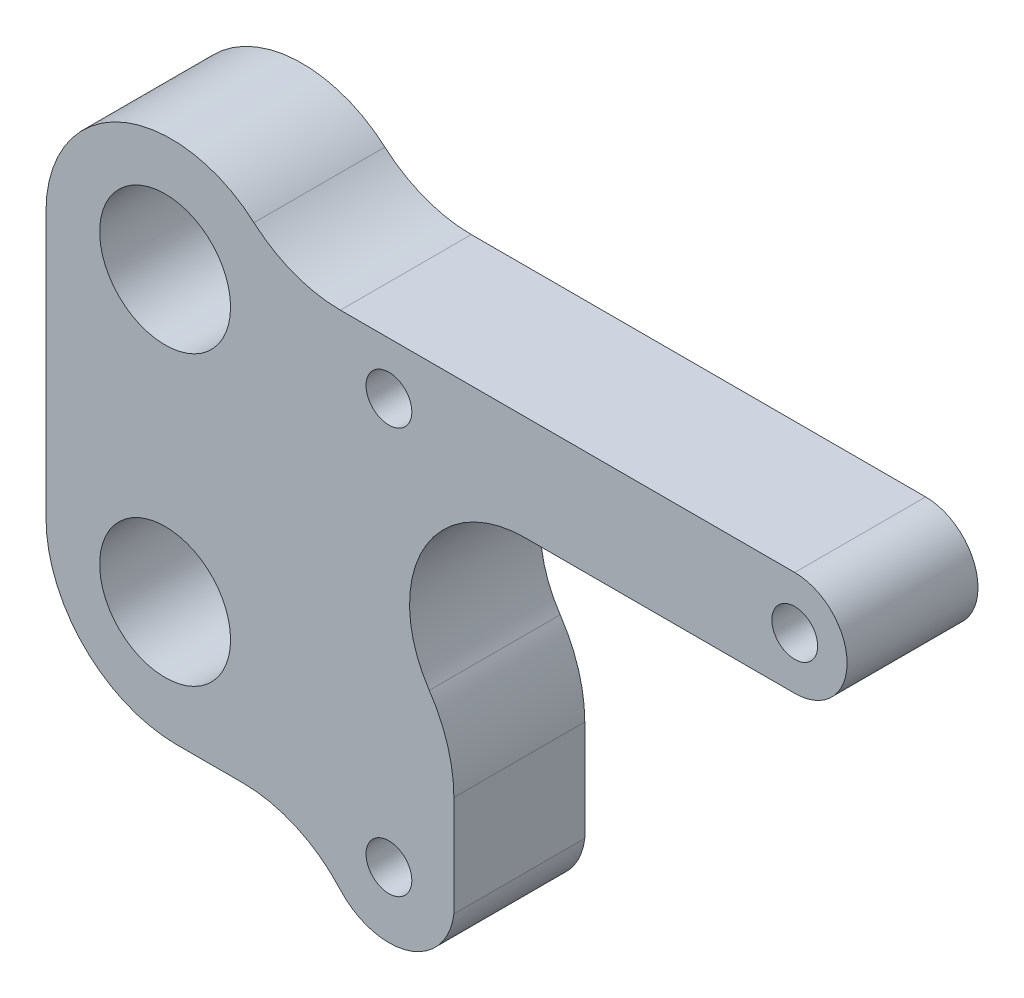
ISO-10303-21;
HEADER;
FILE_DESCRIPTION(('STEP AP214'),'2;1');
FILE_NAME('part.step','',(''),(''),'','','');
FILE_SCHEMA(('AUTOMOTIVE_DESIGN { 1 0 10303 214 1 1 1 1 }'));
ENDSEC;
DATA;
#1=APPLICATION_CONTEXT('core data for automotive mechanical design processes');
#2=APPLICATION_PROTOCOL_DEFINITION('international standard','automotive_design',2000,#1);
#3=PRODUCT_CONTEXT('',#1,'mechanical');
#4=PRODUCT('Part','Part','',(#3));
#5=PRODUCT_RELATED_PRODUCT_CATEGORY('part','',(#4));
#6=PRODUCT_DEFINITION_FORMATION('','',#4);
#7=PRODUCT_DEFINITION_CONTEXT('part definition',#1,'design');
#8=PRODUCT_DEFINITION('design','',#6,#7);
#9=PRODUCT_DEFINITION_SHAPE('','',#8);
#10=(LENGTH_UNIT() NAMED_UNIT(*) SI_UNIT(.MILLI.,.METRE.));
#11=(NAMED_UNIT(*) PLANE_ANGLE_UNIT() SI_UNIT($,.RADIAN.));
#12=(NAMED_UNIT(*) SI_UNIT($,.STERADIAN.) SOLID_ANGLE_UNIT());
#13=UNCERTAINTY_MEASURE_WITH_UNIT(LENGTH_MEASURE(1.E-05),#10,'distance_accuracy_value','');
#14=(GEOMETRIC_REPRESENTATION_CONTEXT(3) GLOBAL_UNCERTAINTY_ASSIGNED_CONTEXT((#13)) GLOBAL_UNIT_ASSIGNED_CONTEXT((#10,
#11,#12)) REPRESENTATION_CONTEXT('',''));
#15=CARTESIAN_POINT('',(0.,0.,0.));
#16=DIRECTION('',(0.,0.,1.));
#17=DIRECTION('',(1.,0.,0.));
#18=AXIS2_PLACEMENT_3D('',#15,#16,#17);
#19=CARTESIAN_POINT('',(46.6269499129951,18.5512629681283,-10.));
#20=DIRECTION('',(0.,0.,1.));
#21=DIRECTION('',(1.,0.,0.));
#22=AXIS2_PLACEMENT_3D('',#19,#20,#21);
#23=CYLINDRICAL_SURFACE('',#22,10.);
#24=CARTESIAN_POINT('',(46.6269499129951,18.5512629681283,0.));
#25=DIRECTION('',(0.,0.,1.));
#26=DIRECTION('',(-1.,0.,0.));
#27=AXIS2_PLACEMENT_3D('',#24,#25,#26);
#28=CIRCLE('',#27,10.);
#29=CARTESIAN_POINT('',(36.6269499129951,18.5512629681283,0.));
#30=VERTEX_POINT('',#29);
#31=CARTESIAN_POINT('',(46.6269499129951,8.55126296812829,0.));
#32=VERTEX_POINT('',#31);
#33=EDGE_CURVE('E160',#30,#32,#28,.T.);
#34=ORIENTED_EDGE('',*,*,#33,.F.);
#35=DIRECTION('',(0.,0.,1.));
#36=VECTOR('',#35,1.);
#37=CARTESIAN_POINT('',(36.6269499129951,18.5512629681283,-10.));
#38=LINE('',#37,#36);
#39=CARTESIAN_POINT('',(36.6269499129951,18.5512629681283,-10.));
#40=VERTEX_POINT('',#39);
#41=EDGE_CURVE('E11',#40,#30,#38,.T.);
#42=ORIENTED_EDGE('',*,*,#41,.F.);
#43=CARTESIAN_POINT('',(46.6269499129951,18.5512629681283,-10.));
#44=DIRECTION('',(0.,0.,1.));
#45=DIRECTION('',(-1.,0.,0.));
#46=AXIS2_PLACEMENT_3D('',#43,#44,#45);
#47=CIRCLE('',#46,10.);
#48=CARTESIAN_POINT('',(46.6269499129951,8.55126296812829,-10.));
#49=VERTEX_POINT('',#48);
#50=EDGE_CURVE('E196',#40,#49,#47,.T.);
#51=ORIENTED_EDGE('',*,*,#50,.T.);
#52=DIRECTION('',(0.,0.,1.));
#53=VECTOR('',#52,1.);
#54=CARTESIAN_POINT('',(46.6269499129951,8.55126296812829,-10.));
#55=LINE('',#54,#53);
#56=EDGE_CURVE('E36',#49,#32,#55,.T.);
#57=ORIENTED_EDGE('',*,*,#56,.T.);
#58=EDGE_LOOP('',(#34,#42,#51,#57));
#59=FACE_BOUND('',#58,.T.);
#60=ADVANCED_FACE('F33',(#59),#23,.T.);
#61=CARTESIAN_POINT('',(36.6269499129951,38.8486320955034,-10.));
#62=DIRECTION('',(-1.,0.,0.));
#63=DIRECTION('',(0.,0.,1.));
#64=AXIS2_PLACEMENT_3D('',#61,#62,#63);
#65=PLANE('',#64);
#66=DIRECTION('',(0.,-1.,0.));
#67=VECTOR('',#66,1.);
#68=CARTESIAN_POINT('',(36.6269499129951,38.8486320955034,0.));
#69=LINE('',#68,#67);
#70=CARTESIAN_POINT('',(36.6269499129951,38.8486320955034,0.));
#71=VERTEX_POINT('',#70);
#72=EDGE_CURVE('E194',#71,#30,#69,.T.);
#73=ORIENTED_EDGE('',*,*,#72,.F.);
#74=DIRECTION('',(0.,0.,1.));
#75=VECTOR('',#74,1.);
#76=CARTESIAN_POINT('',(36.6269499129951,38.8486320955034,-10.));
#77=LINE('',#76,#75);
#78=CARTESIAN_POINT('',(36.6269499129951,38.8486320955034,-10.));
#79=VERTEX_POINT('',#78);
#80=EDGE_CURVE('E42',#79,#71,#77,.T.);
#81=ORIENTED_EDGE('',*,*,#80,.F.);
#82=DIRECTION('',(0.,-1.,0.));
#83=VECTOR('',#82,1.);
#84=CARTESIAN_POINT('',(36.6269499129951,38.8486320955034,-10.));
#85=LINE('',#84,#83);
#86=EDGE_CURVE('E150',#79,#40,#85,.T.);
#87=ORIENTED_EDGE('',*,*,#86,.T.);
#88=ORIENTED_EDGE('',*,*,#41,.T.);
#89=EDGE_LOOP('',(#73,#81,#87,#88));
#90=FACE_BOUND('',#89,.T.);
#91=ADVANCED_FACE('F219',(#90),#65,.T.);
#92=CARTESIAN_POINT('',(46.1979799894816,38.8486320955034,-10.));
#93=DIRECTION('',(0.,0.,1.));
#94=DIRECTION('',(1.,0.,0.));
#95=AXIS2_PLACEMENT_3D('',#92,#93,#94);
#96=CYLINDRICAL_SURFACE('',#95,9.5710300764865);
#97=CARTESIAN_POINT('',(46.1979799894816,38.8486320955034,0.));
#98=DIRECTION('',(0.,0.,1.));
#99=DIRECTION('',(1.,0.,0.));
#100=AXIS2_PLACEMENT_3D('',#97,#98,#99);
#101=CIRCLE('',#100,9.5710300764865);
#102=CARTESIAN_POINT('',(52.5150884874048,46.0388168602,0.));
#103=VERTEX_POINT('',#102);
#104=EDGE_CURVE('E137',#103,#71,#101,.T.);
#105=ORIENTED_EDGE('',*,*,#104,.F.);
#106=DIRECTION('',(0.,0.,1.));
#107=VECTOR('',#106,1.);
#108=CARTESIAN_POINT('',(52.5150884874048,46.0388168602,-10.));
#109=LINE('',#108,#107);
#110=CARTESIAN_POINT('',(52.5150884874048,46.0388168602,-10.));
#111=VERTEX_POINT('',#110);
#112=EDGE_CURVE('E132',#111,#103,#109,.T.);
#113=ORIENTED_EDGE('',*,*,#112,.F.);
#114=CARTESIAN_POINT('',(46.1979799894816,38.8486320955034,-10.));
#115=DIRECTION('',(0.,0.,1.));
#116=DIRECTION('',(1.,0.,0.));
#117=AXIS2_PLACEMENT_3D('',#114,#115,#116);
#118=CIRCLE('',#117,9.5710300764865);
#119=EDGE_CURVE('E135',#111,#79,#118,.T.);
#120=ORIENTED_EDGE('',*,*,#119,.T.);
#121=ORIENTED_EDGE('',*,*,#80,.T.);
#122=EDGE_LOOP('',(#105,#113,#120,#121));
#123=FACE_BOUND('',#122,.T.);
#124=ADVANCED_FACE('F134',(#123),#96,.T.);
#125=CARTESIAN_POINT('',(59.1153273827383,53.5512629681283,-10.));
#126=DIRECTION('',(0.,0.,1.));
#127=DIRECTION('',(1.,0.,0.));
#128=AXIS2_PLACEMENT_3D('',#125,#126,#127);
#129=CYLINDRICAL_SURFACE('',#128,10.);
#130=CARTESIAN_POINT('',(59.1153273827383,53.5512629681283,0.));
#131=DIRECTION('',(0.,0.,-1.));
#132=DIRECTION('',(-1.,0.,0.));
#133=AXIS2_PLACEMENT_3D('',#130,#131,#132);
#134=CIRCLE('',#133,10.);
#135=CARTESIAN_POINT('',(59.1153273827383,43.5512629681283,0.));
#136=VERTEX_POINT('',#135);
#137=EDGE_CURVE('E191',#136,#103,#134,.T.);
#138=ORIENTED_EDGE('',*,*,#137,.F.);
#139=DIRECTION('',(0.,0.,1.));
#140=VECTOR('',#139,1.);
#141=CARTESIAN_POINT('',(59.1153273827383,43.5512629681283,-10.));
#142=LINE('',#141,#140);
#143=CARTESIAN_POINT('',(59.1153273827383,43.5512629681283,-10.));
#144=VERTEX_POINT('',#143);
#145=EDGE_CURVE('E142',#144,#136,#142,.T.);
#146=ORIENTED_EDGE('',*,*,#145,.F.);
#147=CARTESIAN_POINT('',(59.1153273827383,53.5512629681283,-10.));
#148=DIRECTION('',(0.,0.,-1.));
#149=DIRECTION('',(-1.,0.,0.));
#150=AXIS2_PLACEMENT_3D('',#147,#148,#149);
#151=CIRCLE('',#150,10.);
#152=EDGE_CURVE('E148',#144,#111,#151,.T.);
#153=ORIENTED_EDGE('',*,*,#152,.T.);
#154=ORIENTED_EDGE('',*,*,#112,.T.);
#155=EDGE_LOOP('',(#138,#146,#153,#154));
#156=FACE_BOUND('',#155,.T.);
#157=ADVANCED_FACE('F152',(#156),#129,.F.);
#158=CARTESIAN_POINT('',(59.1153273827383,43.5512629681283,-10.));
#159=DIRECTION('',(0.,1.,0.));
#160=DIRECTION('',(-1.,0.,0.));
#161=AXIS2_PLACEMENT_3D('',#158,#159,#160);
#162=PLANE('',#161);
#163=DIRECTION('',(-1.,0.,0.));
#164=VECTOR('',#163,1.);
#165=CARTESIAN_POINT('',(59.1153273827383,43.5512629681283,0.));
#166=LINE('',#165,#164);
#167=CARTESIAN_POINT('',(93.822811009059,43.5512629681283,0.));
#168=VERTEX_POINT('',#167);
#169=EDGE_CURVE('E188',#168,#136,#166,.T.);
#170=ORIENTED_EDGE('',*,*,#169,.F.);
#171=DIRECTION('',(0.,0.,1.));
#172=VECTOR('',#171,1.);
#173=CARTESIAN_POINT('',(93.822811009059,43.5512629681283,-10.));
#174=LINE('',#173,#172);
#175=CARTESIAN_POINT('',(93.822811009059,43.5512629681283,-10.));
#176=VERTEX_POINT('',#175);
#177=EDGE_CURVE('E200',#176,#168,#174,.T.);
#178=ORIENTED_EDGE('',*,*,#177,.F.);
#179=DIRECTION('',(-1.,0.,0.));
#180=VECTOR('',#179,1.);
#181=CARTESIAN_POINT('',(59.1153273827383,43.5512629681283,-10.));
#182=LINE('',#181,#180);
#183=EDGE_CURVE('E153',#176,#144,#182,.T.);
#184=ORIENTED_EDGE('',*,*,#183,.T.);
#185=ORIENTED_EDGE('',*,*,#145,.T.);
#186=EDGE_LOOP('',(#170,#178,#184,#185));
#187=FACE_BOUND('',#186,.T.);
#188=ADVANCED_FACE('F232',(#187),#162,.T.);
#189=CARTESIAN_POINT('',(93.822811009059,39.5512629681283,-10.));
#190=DIRECTION('',(0.,0.,1.));
#191=DIRECTION('',(1.,0.,0.));
#192=AXIS2_PLACEMENT_3D('',#189,#190,#191);
#193=CYLINDRICAL_SURFACE('',#192,4.);
#194=CARTESIAN_POINT('',(93.822811009059,39.5512629681283,0.));
#195=DIRECTION('',(0.,0.,1.));
#196=DIRECTION('',(1.,0.,0.));
#197=AXIS2_PLACEMENT_3D('',#194,#195,#196);
#198=CIRCLE('',#197,4.);
#199=CARTESIAN_POINT('',(93.822811009059,35.5512629681283,0.));
#200=VERTEX_POINT('',#199);
#201=EDGE_CURVE('E185',#200,#168,#198,.T.);
#202=ORIENTED_EDGE('',*,*,#201,.F.);
#203=DIRECTION('',(0.,0.,1.));
#204=VECTOR('',#203,1.);
#205=CARTESIAN_POINT('',(93.822811009059,35.5512629681283,-10.));
#206=LINE('',#205,#204);
#207=CARTESIAN_POINT('',(93.822811009059,35.5512629681283,-10.));
#208=VERTEX_POINT('',#207);
#209=EDGE_CURVE('E202',#208,#200,#206,.T.);
#210=ORIENTED_EDGE('',*,*,#209,.F.);
#211=CARTESIAN_POINT('',(93.822811009059,39.5512629681283,-10.));
#212=DIRECTION('',(0.,0.,1.));
#213=DIRECTION('',(1.,0.,0.));
#214=AXIS2_PLACEMENT_3D('',#211,#212,#213);
#215=CIRCLE('',#214,4.);
#216=EDGE_CURVE('E155',#208,#176,#215,.T.);
#217=ORIENTED_EDGE('',*,*,#216,.T.);
#218=ORIENTED_EDGE('',*,*,#177,.T.);
#219=EDGE_LOOP('',(#202,#210,#217,#218));
#220=FACE_BOUND('',#219,.T.);
#221=ADVANCED_FACE('F235',(#220),#193,.T.);
#222=CARTESIAN_POINT('',(93.822811009059,35.5512629681283,-10.));
#223=DIRECTION('',(0.,-1.,0.));
#224=DIRECTION('',(1.,0.,0.));
#225=AXIS2_PLACEMENT_3D('',#222,#223,#224);
#226=PLANE('',#225);
#227=DIRECTION('',(1.,0.,0.));
#228=VECTOR('',#227,1.);
#229=CARTESIAN_POINT('',(93.822811009059,35.5512629681283,0.));
#230=LINE('',#229,#228);
#231=CARTESIAN_POINT('',(73.2210682176662,35.5512629681283,0.));
#232=VERTEX_POINT('',#231);
#233=EDGE_CURVE('E182',#232,#200,#230,.T.);
#234=ORIENTED_EDGE('',*,*,#233,.F.);
#235=DIRECTION('',(0.,0.,1.));
#236=VECTOR('',#235,1.);
#237=CARTESIAN_POINT('',(73.2210682176662,35.5512629681283,-10.));
#238=LINE('',#237,#236);
#239=CARTESIAN_POINT('',(73.2210682176662,35.5512629681283,-10.));
#240=VERTEX_POINT('',#239);
#241=EDGE_CURVE('E204',#240,#232,#238,.T.);
#242=ORIENTED_EDGE('',*,*,#241,.F.);
#243=DIRECTION('',(1.,0.,0.));
#244=VECTOR('',#243,1.);
#245=CARTESIAN_POINT('',(93.822811009059,35.5512629681283,-10.));
#246=LINE('',#245,#244);
#247=EDGE_CURVE('E345',#240,#208,#246,.T.);
#248=ORIENTED_EDGE('',*,*,#247,.T.);
#249=ORIENTED_EDGE('',*,*,#209,.T.);
#250=EDGE_LOOP('',(#234,#242,#248,#249));
#251=FACE_BOUND('',#250,.T.);
#252=ADVANCED_FACE('F239',(#251),#226,.T.);
#253=CARTESIAN_POINT('',(73.2210682176662,26.7277553175316,-10.));
#254=DIRECTION('',(0.,0.,1.));
#255=DIRECTION('',(1.,0.,0.));
#256=AXIS2_PLACEMENT_3D('',#253,#254,#255);
#257=CYLINDRICAL_SURFACE('',#256,8.8235076505967);
#258=CARTESIAN_POINT('',(73.2210682176662,26.7277553175316,0.));
#259=DIRECTION('',(0.,0.,-1.));
#260=DIRECTION('',(1.,0.,0.));
#261=AXIS2_PLACEMENT_3D('',#258,#259,#260);
#262=CIRCLE('',#261,8.8235076505967);
#263=CARTESIAN_POINT('',(65.9057467434936,21.7941603818232,0.));
#264=VERTEX_POINT('',#263);
#265=EDGE_CURVE('E179',#264,#232,#262,.T.);
#266=ORIENTED_EDGE('',*,*,#265,.F.);
#267=DIRECTION('',(0.,0.,1.));
#268=VECTOR('',#267,1.);
#269=CARTESIAN_POINT('',(65.9057467434936,21.7941603818232,-10.));
#270=LINE('',#269,#268);
#271=CARTESIAN_POINT('',(65.9057467434936,21.7941603818232,-10.));
#272=VERTEX_POINT('',#271);
#273=EDGE_CURVE('E206',#272,#264,#270,.T.);
#274=ORIENTED_EDGE('',*,*,#273,.F.);
#275=CARTESIAN_POINT('',(73.2210682176662,26.7277553175316,-10.));
#276=DIRECTION('',(0.,0.,-1.));
#277=DIRECTION('',(1.,0.,0.));
#278=AXIS2_PLACEMENT_3D('',#275,#276,#277);
#279=CIRCLE('',#278,8.8235076505967);
#280=EDGE_CURVE('E342',#272,#240,#279,.T.);
#281=ORIENTED_EDGE('',*,*,#280,.T.);
#282=ORIENTED_EDGE('',*,*,#241,.T.);
#283=EDGE_LOOP('',(#266,#274,#281,#282));
#284=FACE_BOUND('',#283,.T.);
#285=ADVANCED_FACE('F243',(#284),#257,.F.);
#286=CARTESIAN_POINT('',(56.7859568138665,15.6435968597162,-10.));
#287=DIRECTION('',(0.,0.,1.));
#288=DIRECTION('',(1.,0.,0.));
#289=AXIS2_PLACEMENT_3D('',#286,#287,#288);
#290=CYLINDRICAL_SURFACE('',#289,11.);
#291=CARTESIAN_POINT('',(56.7859568138665,15.6435968597162,0.));
#292=DIRECTION('',(0.,0.,1.));
#293=DIRECTION('',(1.,0.,0.));
#294=AXIS2_PLACEMENT_3D('',#291,#292,#293);
#295=CIRCLE('',#294,11.);
#296=CARTESIAN_POINT('',(67.7859568138665,15.6435968597162,0.));
#297=VERTEX_POINT('',#296);
#298=EDGE_CURVE('E176',#297,#264,#295,.T.);
#299=ORIENTED_EDGE('',*,*,#298,.F.);
#300=DIRECTION('',(0.,0.,1.));
#301=VECTOR('',#300,1.);
#302=CARTESIAN_POINT('',(67.7859568138665,15.6435968597162,-10.));
#303=LINE('',#302,#301);
#304=CARTESIAN_POINT('',(67.7859568138665,15.6435968597162,-10.));
#305=VERTEX_POINT('',#304);
#306=EDGE_CURVE('E208',#305,#297,#303,.T.);
#307=ORIENTED_EDGE('',*,*,#306,.F.);
#308=CARTESIAN_POINT('',(56.7859568138665,15.6435968597162,-10.));
#309=DIRECTION('',(0.,0.,1.));
#310=DIRECTION('',(1.,0.,0.));
#311=AXIS2_PLACEMENT_3D('',#308,#309,#310);
#312=CIRCLE('',#311,11.);
#313=EDGE_CURVE('E339',#305,#272,#312,.T.);
#314=ORIENTED_EDGE('',*,*,#313,.T.);
#315=ORIENTED_EDGE('',*,*,#273,.T.);
#316=EDGE_LOOP('',(#299,#307,#314,#315));
#317=FACE_BOUND('',#316,.T.);
#318=ADVANCED_FACE('F247',(#317),#290,.T.);
#319=CARTESIAN_POINT('',(67.7859568138665,7.94530610479204,-10.));
#320=DIRECTION('',(1.,0.,0.));
#321=DIRECTION('',(0.,0.,-1.));
#322=AXIS2_PLACEMENT_3D('',#319,#320,#321);
#323=PLANE('',#322);
#324=DIRECTION('',(0.,1.,0.));
#325=VECTOR('',#324,1.);
#326=CARTESIAN_POINT('',(67.7859568138665,7.94530610479204,0.));
#327=LINE('',#326,#325);
#328=CARTESIAN_POINT('',(67.7859568138664,7.94530610479205,0.));
#329=VERTEX_POINT('',#328);
#330=EDGE_CURVE('E173',#329,#297,#327,.T.);
#331=ORIENTED_EDGE('',*,*,#330,.F.);
#332=DIRECTION('',(0.,0.,1.));
#333=VECTOR('',#332,1.);
#334=CARTESIAN_POINT('',(67.7859568138664,7.94530610479205,-10.));
#335=LINE('',#334,#333);
#336=CARTESIAN_POINT('',(67.7859568138664,7.94530610479205,-10.));
#337=VERTEX_POINT('',#336);
#338=EDGE_CURVE('E210',#337,#329,#335,.T.);
#339=ORIENTED_EDGE('',*,*,#338,.F.);
#340=DIRECTION('',(0.,1.,0.));
#341=VECTOR('',#340,1.);
#342=CARTESIAN_POINT('',(67.7859568138665,7.94530610479204,-10.));
#343=LINE('',#342,#341);
#344=EDGE_CURVE('E336',#337,#305,#343,.T.);
#345=ORIENTED_EDGE('',*,*,#344,.T.);
#346=ORIENTED_EDGE('',*,*,#306,.T.);
#347=EDGE_LOOP('',(#331,#339,#345,#346));
#348=FACE_BOUND('',#347,.T.);
#349=ADVANCED_FACE('F251',(#348),#323,.T.);
#350=CARTESIAN_POINT('',(62.8228110090593,8.55126296812829,-10.));
#351=DIRECTION('',(0.,0.,1.));
#352=DIRECTION('',(1.,0.,0.));
#353=AXIS2_PLACEMENT_3D('',#350,#351,#352);
#354=CYLINDRICAL_SURFACE('',#353,4.99999999999991);
#355=CARTESIAN_POINT('',(62.8228110090593,8.55126296812829,0.));
#356=DIRECTION('',(0.,0.,1.));
#357=DIRECTION('',(1.,0.,0.));
#358=AXIS2_PLACEMENT_3D('',#355,#356,#357);
#359=CIRCLE('',#358,4.99999999999991);
#360=CARTESIAN_POINT('',(59.0960310465593,5.21792963479496,0.));
#361=VERTEX_POINT('',#360);
#362=EDGE_CURVE('E170',#361,#329,#359,.T.);
#363=ORIENTED_EDGE('',*,*,#362,.F.);
#364=DIRECTION('',(0.,0.,1.));
#365=VECTOR('',#364,1.);
#366=CARTESIAN_POINT('',(59.0960310465593,5.21792963479496,-10.));
#367=LINE('',#366,#365);
#368=CARTESIAN_POINT('',(59.0960310465593,5.21792963479496,-10.));
#369=VERTEX_POINT('',#368);
#370=EDGE_CURVE('E212',#369,#361,#367,.T.);
#371=ORIENTED_EDGE('',*,*,#370,.F.);
#372=CARTESIAN_POINT('',(62.822811009059,8.55126296812829,-10.));
#373=DIRECTION('',(0.,0.,1.));
#374=DIRECTION('',(1.,0.,0.));
#375=AXIS2_PLACEMENT_3D('',#372,#373,#374);
#376=CIRCLE('',#375,5.);
#377=EDGE_CURVE('E334',#369,#337,#376,.T.);
#378=ORIENTED_EDGE('',*,*,#377,.T.);
#379=ORIENTED_EDGE('',*,*,#338,.T.);
#380=EDGE_LOOP('',(#363,#371,#378,#379));
#381=FACE_BOUND('',#380,.T.);
#382=ADVANCED_FACE('F255',(#381),#354,.T.);
#383=CARTESIAN_POINT('',(51.64247112156,-1.44873703187171,-10.));
#384=DIRECTION('',(0.,0.,1.));
#385=DIRECTION('',(1.,0.,0.));
#386=AXIS2_PLACEMENT_3D('',#383,#384,#385);
#387=CYLINDRICAL_SURFACE('',#386,10.);
#388=CARTESIAN_POINT('',(51.64247112156,-1.44873703187171,0.));
#389=DIRECTION('',(0.,0.,-1.));
#390=DIRECTION('',(1.,0.,0.));
#391=AXIS2_PLACEMENT_3D('',#388,#389,#390);
#392=CIRCLE('',#391,10.);
#393=CARTESIAN_POINT('',(51.64247112156,8.55126296812829,0.));
#394=VERTEX_POINT('',#393);
#395=EDGE_CURVE('E167',#394,#361,#392,.T.);
#396=ORIENTED_EDGE('',*,*,#395,.F.);
#397=DIRECTION('',(0.,0.,1.));
#398=VECTOR('',#397,1.);
#399=CARTESIAN_POINT('',(51.64247112156,8.55126296812829,-10.));
#400=LINE('',#399,#398);
#401=CARTESIAN_POINT('',(51.64247112156,8.55126296812829,-10.));
#402=VERTEX_POINT('',#401);
#403=EDGE_CURVE('E214',#402,#394,#400,.T.);
#404=ORIENTED_EDGE('',*,*,#403,.F.);
#405=CARTESIAN_POINT('',(51.64247112156,-1.44873703187171,-10.));
#406=DIRECTION('',(0.,0.,-1.));
#407=DIRECTION('',(1.,0.,0.));
#408=AXIS2_PLACEMENT_3D('',#405,#406,#407);
#409=CIRCLE('',#408,10.);
#410=EDGE_CURVE('E331',#402,#369,#409,.T.);
#411=ORIENTED_EDGE('',*,*,#410,.T.);
#412=ORIENTED_EDGE('',*,*,#370,.T.);
#413=EDGE_LOOP('',(#396,#404,#411,#412));
#414=FACE_BOUND('',#413,.T.);
#415=ADVANCED_FACE('F259',(#414),#387,.F.);
#416=CARTESIAN_POINT('',(51.64247112156,8.55126296812829,-10.));
#417=DIRECTION('',(0.,-1.,0.));
#418=DIRECTION('',(1.,0.,0.));
#419=AXIS2_PLACEMENT_3D('',#416,#417,#418);
#420=PLANE('',#419);
#421=DIRECTION('',(1.,0.,0.));
#422=VECTOR('',#421,1.);
#423=CARTESIAN_POINT('',(51.64247112156,8.55126296812829,0.));
#424=LINE('',#423,#422);
#425=EDGE_CURVE('E163',#32,#394,#424,.T.);
#426=ORIENTED_EDGE('',*,*,#425,.F.);
#427=ORIENTED_EDGE('',*,*,#56,.F.);
#428=DIRECTION('',(1.,0.,0.));
#429=VECTOR('',#428,1.);
#430=CARTESIAN_POINT('',(51.64247112156,8.55126296812829,-10.));
#431=LINE('',#430,#429);
#432=EDGE_CURVE('E329',#49,#402,#431,.T.);
#433=ORIENTED_EDGE('',*,*,#432,.T.);
#434=ORIENTED_EDGE('',*,*,#403,.T.);
#435=EDGE_LOOP('',(#426,#427,#433,#434));
#436=FACE_BOUND('',#435,.T.);
#437=ADVANCED_FACE('F216',(#436),#420,.T.);
#438=CARTESIAN_POINT('',(46.6269499129951,18.5512629681283,-10.));
#439=DIRECTION('',(0.,0.,-1.));
#440=DIRECTION('',(-1.,0.,0.));
#441=AXIS2_PLACEMENT_3D('',#438,#439,#440);
#442=PLANE('',#441);
#443=CARTESIAN_POINT('',(45.7250557814575,17.5512648754769,-10.));
#444=DIRECTION('',(0.,0.,1.));
#445=DIRECTION('',(1.,0.,0.));
#446=AXIS2_PLACEMENT_3D('',#443,#444,#445);
#447=CIRCLE('',#446,5.);
#448=CARTESIAN_POINT('',(50.7250557814574,17.5512648754769,-10.));
#449=VERTEX_POINT('',#448);
#450=EDGE_CURVE('E298',#449,#449,#447,.T.);
#451=ORIENTED_EDGE('',*,*,#450,.T.);
#452=EDGE_LOOP('',(#451));
#453=FACE_BOUND('',#452,.T.);
#454=CARTESIAN_POINT('',(45.7250557814575,39.5512629681283,-10.));
#455=DIRECTION('',(0.,0.,1.));
#456=DIRECTION('',(1.,0.,0.));
#457=AXIS2_PLACEMENT_3D('',#454,#455,#456);
#458=CIRCLE('',#457,5.);
#459=CARTESIAN_POINT('',(50.7250557814575,39.5512629681283,-10.));
#460=VERTEX_POINT('',#459);
#461=EDGE_CURVE('E306',#460,#460,#458,.T.);
#462=ORIENTED_EDGE('',*,*,#461,.T.);
#463=EDGE_LOOP('',(#462));
#464=FACE_BOUND('',#463,.T.);
#465=CARTESIAN_POINT('',(62.822811009059,8.55126296812829,-10.));
#466=DIRECTION('',(0.,0.,1.));
#467=DIRECTION('',(1.,0.,0.));
#468=AXIS2_PLACEMENT_3D('',#465,#466,#467);
#469=CIRCLE('',#468,1.74999999999998);
#470=CARTESIAN_POINT('',(64.572811009059,8.55126296812829,-10.));
#471=VERTEX_POINT('',#470);
#472=EDGE_CURVE('E312',#471,#471,#469,.T.);
#473=ORIENTED_EDGE('',*,*,#472,.T.);
#474=EDGE_LOOP('',(#473));
#475=FACE_BOUND('',#474,.T.);
#476=CARTESIAN_POINT('',(62.822811009059,39.5512629681283,-10.));
#477=DIRECTION('',(0.,0.,1.));
#478=DIRECTION('',(1.,0.,0.));
#479=AXIS2_PLACEMENT_3D('',#476,#477,#478);
#480=CIRCLE('',#479,1.74999999999998);
#481=CARTESIAN_POINT('',(64.572811009059,39.5512629681283,-10.));
#482=VERTEX_POINT('',#481);
#483=EDGE_CURVE('E318',#482,#482,#480,.T.);
#484=ORIENTED_EDGE('',*,*,#483,.T.);
#485=EDGE_LOOP('',(#484));
#486=FACE_BOUND('',#485,.T.);
#487=CARTESIAN_POINT('',(93.822811009059,39.5512629681283,-10.));
#488=DIRECTION('',(0.,0.,1.));
#489=DIRECTION('',(1.,0.,0.));
#490=AXIS2_PLACEMENT_3D('',#487,#488,#489);
#491=CIRCLE('',#490,1.75);
#492=CARTESIAN_POINT('',(95.572811009059,39.5512629681283,-10.));
#493=VERTEX_POINT('',#492);
#494=EDGE_CURVE('E164',#493,#493,#491,.T.);
#495=ORIENTED_EDGE('',*,*,#494,.T.);
#496=EDGE_LOOP('',(#495));
#497=FACE_BOUND('',#496,.T.);
#498=ORIENTED_EDGE('',*,*,#50,.F.);
#499=ORIENTED_EDGE('',*,*,#86,.F.);
#500=ORIENTED_EDGE('',*,*,#119,.F.);
#501=ORIENTED_EDGE('',*,*,#152,.F.);
#502=ORIENTED_EDGE('',*,*,#183,.F.);
#503=ORIENTED_EDGE('',*,*,#216,.F.);
#504=ORIENTED_EDGE('',*,*,#247,.F.);
#505=ORIENTED_EDGE('',*,*,#280,.F.);
#506=ORIENTED_EDGE('',*,*,#313,.F.);
#507=ORIENTED_EDGE('',*,*,#344,.F.);
#508=ORIENTED_EDGE('',*,*,#377,.F.);
#509=ORIENTED_EDGE('',*,*,#410,.F.);
#510=ORIENTED_EDGE('',*,*,#432,.F.);
#511=EDGE_LOOP('',(#498,#499,#500,#501,#502,#503,#504,#505,#506,#507,#508,#509,#510));
#512=FACE_BOUND('',#511,.T.);
#513=ADVANCED_FACE('F146',(#453,#464,#475,#486,#497,#512),#442,.T.);
#514=CARTESIAN_POINT('',(46.6269499129951,18.5512629681283,0.));
#515=DIRECTION('',(0.,0.,-1.));
#516=DIRECTION('',(-1.,0.,0.));
#517=AXIS2_PLACEMENT_3D('',#514,#515,#516);
#518=PLANE('',#517);
#519=CARTESIAN_POINT('',(45.7250557814575,17.5512648754769,0.));
#520=DIRECTION('',(0.,0.,1.));
#521=DIRECTION('',(1.,0.,0.));
#522=AXIS2_PLACEMENT_3D('',#519,#520,#521);
#523=CIRCLE('',#522,5.);
#524=CARTESIAN_POINT('',(50.7250557814574,17.5512648754769,0.));
#525=VERTEX_POINT('',#524);
#526=EDGE_CURVE('E301',#525,#525,#523,.T.);
#527=ORIENTED_EDGE('',*,*,#526,.F.);
#528=EDGE_LOOP('',(#527));
#529=FACE_BOUND('',#528,.T.);
#530=CARTESIAN_POINT('',(45.7250557814575,39.5512629681283,0.));
#531=DIRECTION('',(0.,0.,1.));
#532=DIRECTION('',(1.,0.,0.));
#533=AXIS2_PLACEMENT_3D('',#530,#531,#532);
#534=CIRCLE('',#533,5.);
#535=CARTESIAN_POINT('',(50.7250557814575,39.5512629681283,0.));
#536=VERTEX_POINT('',#535);
#537=EDGE_CURVE('E303',#536,#536,#534,.T.);
#538=ORIENTED_EDGE('',*,*,#537,.F.);
#539=EDGE_LOOP('',(#538));
#540=FACE_BOUND('',#539,.T.);
#541=CARTESIAN_POINT('',(62.822811009059,8.55126296812829,0.));
#542=DIRECTION('',(0.,0.,1.));
#543=DIRECTION('',(1.,0.,0.));
#544=AXIS2_PLACEMENT_3D('',#541,#542,#543);
#545=CIRCLE('',#544,1.74999999999998);
#546=CARTESIAN_POINT('',(64.572811009059,8.55126296812829,0.));
#547=VERTEX_POINT('',#546);
#548=EDGE_CURVE('E309',#547,#547,#545,.T.);
#549=ORIENTED_EDGE('',*,*,#548,.F.);
#550=EDGE_LOOP('',(#549));
#551=FACE_BOUND('',#550,.T.);
#552=CARTESIAN_POINT('',(62.822811009059,39.5512629681283,0.));
#553=DIRECTION('',(0.,0.,1.));
#554=DIRECTION('',(1.,0.,0.));
#555=AXIS2_PLACEMENT_3D('',#552,#553,#554);
#556=CIRCLE('',#555,1.74999999999998);
#557=CARTESIAN_POINT('',(64.572811009059,39.5512629681283,0.));
#558=VERTEX_POINT('',#557);
#559=EDGE_CURVE('E315',#558,#558,#556,.T.);
#560=ORIENTED_EDGE('',*,*,#559,.F.);
#561=EDGE_LOOP('',(#560));
#562=FACE_BOUND('',#561,.T.);
#563=CARTESIAN_POINT('',(93.822811009059,39.5512629681283,0.));
#564=DIRECTION('',(0.,0.,1.));
#565=DIRECTION('',(1.,0.,0.));
#566=AXIS2_PLACEMENT_3D('',#563,#564,#565);
#567=CIRCLE('',#566,1.75);
#568=CARTESIAN_POINT('',(95.572811009059,39.5512629681283,0.));
#569=VERTEX_POINT('',#568);
#570=EDGE_CURVE('E321',#569,#569,#567,.T.);
#571=ORIENTED_EDGE('',*,*,#570,.F.);
#572=EDGE_LOOP('',(#571));
#573=FACE_BOUND('',#572,.T.);
#574=ORIENTED_EDGE('',*,*,#33,.T.);
#575=ORIENTED_EDGE('',*,*,#425,.T.);
#576=ORIENTED_EDGE('',*,*,#395,.T.);
#577=ORIENTED_EDGE('',*,*,#362,.T.);
#578=ORIENTED_EDGE('',*,*,#330,.T.);
#579=ORIENTED_EDGE('',*,*,#298,.T.);
#580=ORIENTED_EDGE('',*,*,#265,.T.);
#581=ORIENTED_EDGE('',*,*,#233,.T.);
#582=ORIENTED_EDGE('',*,*,#201,.T.);
#583=ORIENTED_EDGE('',*,*,#169,.T.);
#584=ORIENTED_EDGE('',*,*,#137,.T.);
#585=ORIENTED_EDGE('',*,*,#104,.T.);
#586=ORIENTED_EDGE('',*,*,#72,.T.);
#587=EDGE_LOOP('',(#574,#575,#576,#577,#578,#579,#580,#581,#582,#583,#584,#585,#586));
#588=FACE_BOUND('',#587,.T.);
#589=ADVANCED_FACE('F218',(#529,#540,#551,#562,#573,#588),#518,.F.);
#590=CARTESIAN_POINT('',(93.822811009059,39.5512629681283,-10.));
#591=DIRECTION('',(0.,0.,1.));
#592=DIRECTION('',(1.,0.,0.));
#593=AXIS2_PLACEMENT_3D('',#590,#591,#592);
#594=CYLINDRICAL_SURFACE('',#593,1.75);
#595=ORIENTED_EDGE('',*,*,#494,.F.);
#596=EDGE_LOOP('',(#595));
#597=FACE_BOUND('',#596,.T.);
#598=ORIENTED_EDGE('',*,*,#570,.T.);
#599=EDGE_LOOP('',(#598));
#600=FACE_BOUND('',#599,.T.);
#601=ADVANCED_FACE('F271',(#597,#600),#594,.F.);
#602=CARTESIAN_POINT('',(62.822811009059,39.5512629681283,-10.));
#603=DIRECTION('',(0.,0.,1.));
#604=DIRECTION('',(1.,0.,0.));
#605=AXIS2_PLACEMENT_3D('',#602,#603,#604);
#606=CYLINDRICAL_SURFACE('',#605,1.74999999999998);
#607=ORIENTED_EDGE('',*,*,#483,.F.);
#608=EDGE_LOOP('',(#607));
#609=FACE_BOUND('',#608,.T.);
#610=ORIENTED_EDGE('',*,*,#559,.T.);
#611=EDGE_LOOP('',(#610));
#612=FACE_BOUND('',#611,.T.);
#613=ADVANCED_FACE('F278',(#609,#612),#606,.F.);
#614=CARTESIAN_POINT('',(62.822811009059,8.55126296812829,-10.));
#615=DIRECTION('',(0.,0.,1.));
#616=DIRECTION('',(1.,0.,0.));
#617=AXIS2_PLACEMENT_3D('',#614,#615,#616);
#618=CYLINDRICAL_SURFACE('',#617,1.74999999999998);
#619=ORIENTED_EDGE('',*,*,#472,.F.);
#620=EDGE_LOOP('',(#619));
#621=FACE_BOUND('',#620,.T.);
#622=ORIENTED_EDGE('',*,*,#548,.T.);
#623=EDGE_LOOP('',(#622));
#624=FACE_BOUND('',#623,.T.);
#625=ADVANCED_FACE('F282',(#621,#624),#618,.F.);
#626=CARTESIAN_POINT('',(45.7250557814575,39.5512629681283,-10.));
#627=DIRECTION('',(0.,0.,1.));
#628=DIRECTION('',(1.,0.,0.));
#629=AXIS2_PLACEMENT_3D('',#626,#627,#628);
#630=CYLINDRICAL_SURFACE('',#629,5.);
#631=ORIENTED_EDGE('',*,*,#461,.F.);
#632=EDGE_LOOP('',(#631));
#633=FACE_BOUND('',#632,.T.);
#634=ORIENTED_EDGE('',*,*,#537,.T.);
#635=EDGE_LOOP('',(#634));
#636=FACE_BOUND('',#635,.T.);
#637=ADVANCED_FACE('F286',(#633,#636),#630,.F.);
#638=CARTESIAN_POINT('',(45.7250557814575,17.5512648754769,-10.));
#639=DIRECTION('',(0.,0.,1.));
#640=DIRECTION('',(1.,0.,0.));
#641=AXIS2_PLACEMENT_3D('',#638,#639,#640);
#642=CYLINDRICAL_SURFACE('',#641,5.);
#643=ORIENTED_EDGE('',*,*,#450,.F.);
#644=EDGE_LOOP('',(#643));
#645=FACE_BOUND('',#644,.T.);
#646=ORIENTED_EDGE('',*,*,#526,.T.);
#647=EDGE_LOOP('',(#646));
#648=FACE_BOUND('',#647,.T.);
#649=ADVANCED_FACE('F290',(#645,#648),#642,.F.);
#650=CLOSED_SHELL('',(#60,#91,#124,#157,#188,#221,#252,#285,#318,#349,#382,#415,#437,#513,#589,
#601,#613,#625,#637,#649));
#651=MANIFOLD_SOLID_BREP('B2',#650);
#652=ADVANCED_BREP_SHAPE_REPRESENTATION('',(#18,#651),#14);
#653=SHAPE_DEFINITION_REPRESENTATION(#9,#652);
ENDSEC;
END-ISO-10303-21;
